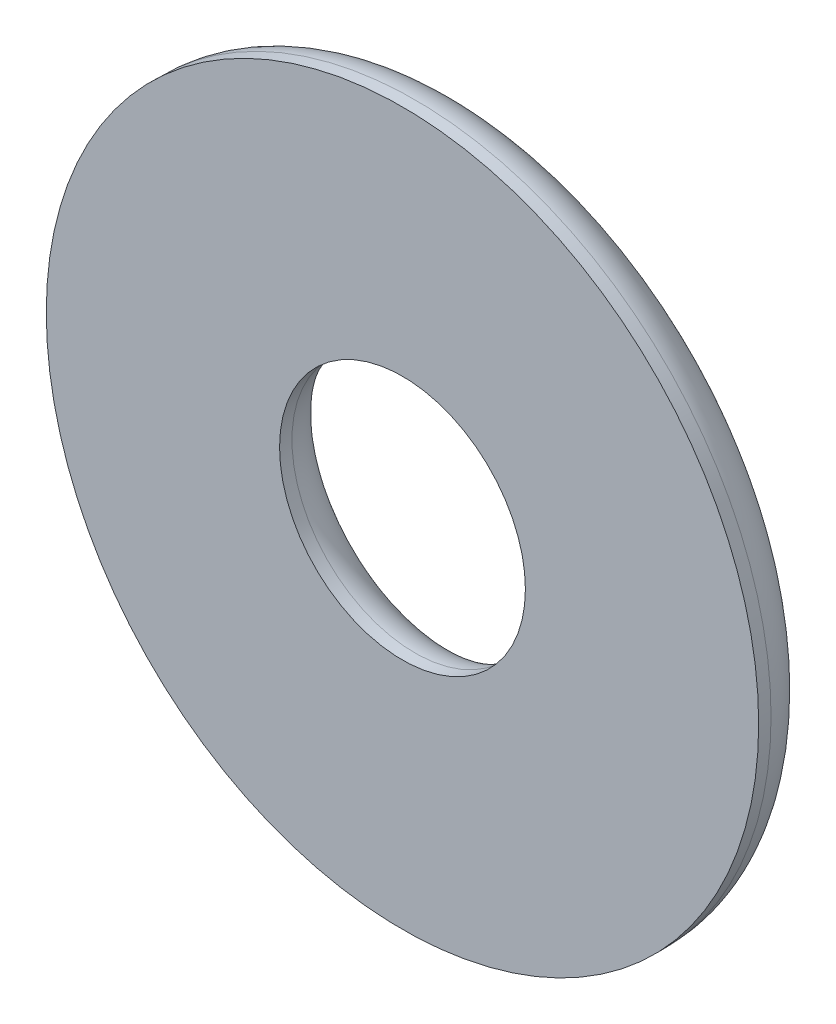
ISO-10303-21;
HEADER;
FILE_DESCRIPTION(('STEP AP214'),'2;1');
FILE_NAME('part.step','',(''),(''),'','','');
FILE_SCHEMA(('AUTOMOTIVE_DESIGN { 1 0 10303 214 1 1 1 1 }'));
ENDSEC;
DATA;
#1=APPLICATION_CONTEXT('core data for automotive mechanical design processes');
#2=APPLICATION_PROTOCOL_DEFINITION('international standard','automotive_design',2000,#1);
#3=PRODUCT_CONTEXT('',#1,'mechanical');
#4=PRODUCT('Part','Part','',(#3));
#5=PRODUCT_RELATED_PRODUCT_CATEGORY('part','',(#4));
#6=PRODUCT_DEFINITION_FORMATION('','',#4);
#7=PRODUCT_DEFINITION_CONTEXT('part definition',#1,'design');
#8=PRODUCT_DEFINITION('design','',#6,#7);
#9=PRODUCT_DEFINITION_SHAPE('','',#8);
#10=(LENGTH_UNIT() NAMED_UNIT(*) SI_UNIT(.MILLI.,.METRE.));
#11=(NAMED_UNIT(*) PLANE_ANGLE_UNIT() SI_UNIT($,.RADIAN.));
#12=(NAMED_UNIT(*) SI_UNIT($,.STERADIAN.) SOLID_ANGLE_UNIT());
#13=UNCERTAINTY_MEASURE_WITH_UNIT(LENGTH_MEASURE(1.E-05),#10,'distance_accuracy_value','');
#14=(GEOMETRIC_REPRESENTATION_CONTEXT(3) GLOBAL_UNCERTAINTY_ASSIGNED_CONTEXT((#13)) GLOBAL_UNIT_ASSIGNED_CONTEXT((#10,
#11,#12)) REPRESENTATION_CONTEXT('',''));
#15=CARTESIAN_POINT('',(0.,0.,0.));
#16=DIRECTION('',(0.,0.,1.));
#17=DIRECTION('',(1.,0.,0.));
#18=AXIS2_PLACEMENT_3D('',#15,#16,#17);
#19=CARTESIAN_POINT('',(176.372942693362,103.404109270251,-19.812));
#20=DIRECTION('',(0.,0.,1.));
#21=DIRECTION('',(1.,0.,0.));
#22=AXIS2_PLACEMENT_3D('',#19,#20,#21);
#23=TOROIDAL_SURFACE('',#22,3.33419836929094,0.508);
#24=CARTESIAN_POINT('',(176.372942693362,103.404109270251,-20.32));
#25=DIRECTION('',(0.,0.,-1.));
#26=DIRECTION('',(1.,0.,0.));
#27=AXIS2_PLACEMENT_3D('',#24,#25,#26);
#28=CIRCLE('',#27,3.33419836929094);
#29=CARTESIAN_POINT('',(179.707141062653,103.404109270251,-20.32));
#30=VERTEX_POINT('',#29);
#31=EDGE_CURVE('E52',#30,#30,#28,.F.);
#32=ORIENTED_EDGE('',*,*,#31,.T.);
#33=EDGE_LOOP('',(#32));
#34=FACE_BOUND('',#33,.T.);
#35=CARTESIAN_POINT('',(176.372942693362,103.404109270251,-19.8208658224702));
#36=DIRECTION('',(0.,0.,-1.));
#37=DIRECTION('',(1.,0.,0.));
#38=AXIS2_PLACEMENT_3D('',#35,#36,#37);
#39=CIRCLE('',#38,3.84212099843039);
#40=CARTESIAN_POINT('',(180.215063691793,103.404109270251,-19.8208658224702));
#41=VERTEX_POINT('',#40);
#42=EDGE_CURVE('E48',#41,#41,#39,.T.);
#43=ORIENTED_EDGE('',*,*,#42,.T.);
#44=EDGE_LOOP('',(#43));
#45=FACE_BOUND('',#44,.T.);
#46=ADVANCED_FACE('F35',(#34,#45),#23,.T.);
#47=CARTESIAN_POINT('',(176.372942693362,103.404109270251,-19.05));
#48=DIRECTION('',(0.,0.,1.));
#49=DIRECTION('',(1.,0.,0.));
#50=AXIS2_PLACEMENT_3D('',#47,#48,#49);
#51=CONICAL_SURFACE('',#50,3.85557651141255,0.0174532925199433);
#52=CARTESIAN_POINT('',(176.372942693362,103.404109270251,-19.685));
#53=DIRECTION('',(0.,0.,-1.));
#54=DIRECTION('',(-1.,0.,0.));
#55=AXIS2_PLACEMENT_3D('',#52,#53,#54);
#56=CIRCLE('',#55,3.84449254518313);
#57=CARTESIAN_POINT('',(172.528450148179,103.404109270251,-19.685));
#58=VERTEX_POINT('',#57);
#59=EDGE_CURVE('E54',#58,#58,#56,.F.);
#60=ORIENTED_EDGE('',*,*,#59,.F.);
#61=EDGE_LOOP('',(#60));
#62=FACE_BOUND('',#61,.T.);
#63=ORIENTED_EDGE('',*,*,#42,.F.);
#64=EDGE_LOOP('',(#63));
#65=FACE_BOUND('',#64,.T.);
#66=ADVANCED_FACE('F76',(#62,#65),#51,.T.);
#67=CARTESIAN_POINT('',(176.372942693362,103.404109270251,-20.32));
#68=DIRECTION('',(0.,0.,1.));
#69=DIRECTION('',(1.,0.,0.));
#70=AXIS2_PLACEMENT_3D('',#67,#68,#69);
#71=PLANE('',#70);
#72=ORIENTED_EDGE('',*,*,#31,.F.);
#73=EDGE_LOOP('',(#72));
#74=FACE_BOUND('',#73,.T.);
#75=CARTESIAN_POINT('',(176.372942693362,103.404109270251,-20.32));
#76=DIRECTION('',(0.,0.,-1.));
#77=DIRECTION('',(1.,0.,0.));
#78=AXIS2_PLACEMENT_3D('',#75,#76,#77);
#79=CIRCLE('',#78,1.83695465353414);
#80=CARTESIAN_POINT('',(178.209897346896,103.404109270251,-20.32));
#81=VERTEX_POINT('',#80);
#82=EDGE_CURVE('E11',#81,#81,#79,.T.);
#83=ORIENTED_EDGE('',*,*,#82,.F.);
#84=EDGE_LOOP('',(#83));
#85=FACE_BOUND('',#84,.T.);
#86=ADVANCED_FACE('F80',(#74,#85),#71,.F.);
#87=CARTESIAN_POINT('',(176.372942693362,103.404109270251,-19.812));
#88=DIRECTION('',(0.,0.,1.));
#89=DIRECTION('',(1.,0.,0.));
#90=AXIS2_PLACEMENT_3D('',#87,#88,#89);
#91=TOROIDAL_SURFACE('',#90,1.83695465353414,0.508);
#92=CARTESIAN_POINT('',(176.372942693362,103.404109270251,-19.8208658224702));
#93=DIRECTION('',(0.,0.,-1.));
#94=DIRECTION('',(1.,0.,0.));
#95=AXIS2_PLACEMENT_3D('',#92,#93,#94);
#96=CIRCLE('',#95,1.3290320243947);
#97=CARTESIAN_POINT('',(177.701974717757,103.404109270251,-19.8208658224702));
#98=VERTEX_POINT('',#97);
#99=EDGE_CURVE('E43',#98,#98,#96,.F.);
#100=ORIENTED_EDGE('',*,*,#99,.T.);
#101=EDGE_LOOP('',(#100));
#102=FACE_BOUND('',#101,.T.);
#103=ORIENTED_EDGE('',*,*,#82,.T.);
#104=EDGE_LOOP('',(#103));
#105=FACE_BOUND('',#104,.T.);
#106=ADVANCED_FACE('F37',(#102,#105),#91,.T.);
#107=CARTESIAN_POINT('',(176.372942693362,103.404109270251,-19.05));
#108=DIRECTION('',(0.,0.,-1.));
#109=DIRECTION('',(1.,0.,0.));
#110=AXIS2_PLACEMENT_3D('',#107,#108,#109);
#111=CONICAL_SURFACE('',#110,1.31557651141254,0.0174532925199433);
#112=CARTESIAN_POINT('',(176.372942693362,103.404109270251,-19.685));
#113=DIRECTION('',(0.,0.,-1.));
#114=DIRECTION('',(-1.,0.,0.));
#115=AXIS2_PLACEMENT_3D('',#112,#113,#114);
#116=CIRCLE('',#115,1.32666047764195);
#117=CARTESIAN_POINT('',(175.04628221572,103.404109270251,-19.685));
#118=VERTEX_POINT('',#117);
#119=EDGE_CURVE('E39',#118,#118,#116,.F.);
#120=ORIENTED_EDGE('',*,*,#119,.T.);
#121=EDGE_LOOP('',(#120));
#122=FACE_BOUND('',#121,.T.);
#123=ORIENTED_EDGE('',*,*,#99,.F.);
#124=EDGE_LOOP('',(#123));
#125=FACE_BOUND('',#124,.T.);
#126=ADVANCED_FACE('F64',(#122,#125),#111,.F.);
#127=CARTESIAN_POINT('',(208.28,20.6375,-19.685));
#128=DIRECTION('',(0.,0.,-1.));
#129=DIRECTION('',(-1.,0.,0.));
#130=AXIS2_PLACEMENT_3D('',#127,#128,#129);
#131=PLANE('',#130);
#132=ORIENTED_EDGE('',*,*,#59,.T.);
#133=EDGE_LOOP('',(#132));
#134=FACE_BOUND('',#133,.T.);
#135=ORIENTED_EDGE('',*,*,#119,.F.);
#136=EDGE_LOOP('',(#135));
#137=FACE_BOUND('',#136,.T.);
#138=ADVANCED_FACE('F67',(#134,#137),#131,.F.);
#139=CLOSED_SHELL('',(#46,#66,#86,#106,#126,#138));
#140=MANIFOLD_SOLID_BREP('B2',#139);
#141=ADVANCED_BREP_SHAPE_REPRESENTATION('',(#18,#140),#14);
#142=SHAPE_DEFINITION_REPRESENTATION(#9,#141);
ENDSEC;
END-ISO-10303-21;
